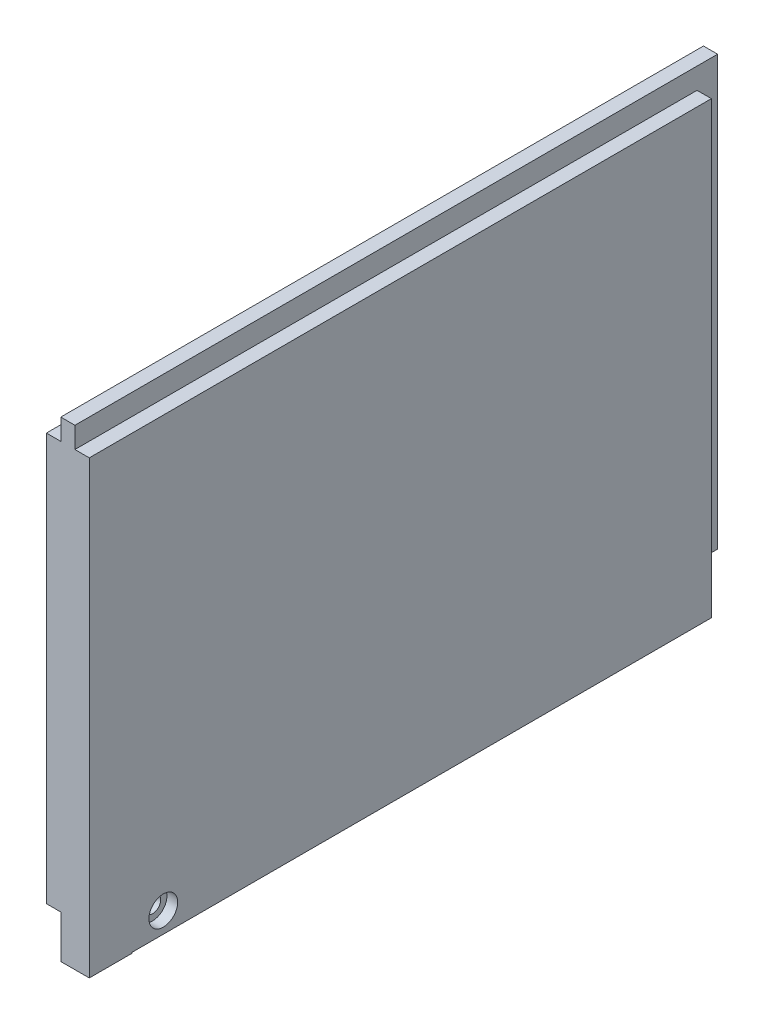
ISO-10303-21;
HEADER;
FILE_DESCRIPTION(('STEP AP214'),'2;1');
FILE_NAME('part.step','',(''),(''),'','','');
FILE_SCHEMA(('AUTOMOTIVE_DESIGN { 1 0 10303 214 1 1 1 1 }'));
ENDSEC;
DATA;
#1=APPLICATION_CONTEXT('core data for automotive mechanical design processes');
#2=APPLICATION_PROTOCOL_DEFINITION('international standard','automotive_design',2000,#1);
#3=PRODUCT_CONTEXT('',#1,'mechanical');
#4=PRODUCT('Part','Part','',(#3));
#5=PRODUCT_RELATED_PRODUCT_CATEGORY('part','',(#4));
#6=PRODUCT_DEFINITION_FORMATION('','',#4);
#7=PRODUCT_DEFINITION_CONTEXT('part definition',#1,'design');
#8=PRODUCT_DEFINITION('design','',#6,#7);
#9=PRODUCT_DEFINITION_SHAPE('','',#8);
#10=(LENGTH_UNIT() NAMED_UNIT(*) SI_UNIT(.MILLI.,.METRE.));
#11=(NAMED_UNIT(*) PLANE_ANGLE_UNIT() SI_UNIT($,.RADIAN.));
#12=(NAMED_UNIT(*) SI_UNIT($,.STERADIAN.) SOLID_ANGLE_UNIT());
#13=UNCERTAINTY_MEASURE_WITH_UNIT(LENGTH_MEASURE(1.E-05),#10,'distance_accuracy_value','');
#14=(GEOMETRIC_REPRESENTATION_CONTEXT(3) GLOBAL_UNCERTAINTY_ASSIGNED_CONTEXT((#13)) GLOBAL_UNIT_ASSIGNED_CONTEXT((#10,
#11,#12)) REPRESENTATION_CONTEXT('',''));
#15=CARTESIAN_POINT('',(0.,0.,0.));
#16=DIRECTION('',(0.,0.,1.));
#17=DIRECTION('',(1.,0.,0.));
#18=AXIS2_PLACEMENT_3D('',#15,#16,#17);
#19=CARTESIAN_POINT('',(0.,0.,0.));
#20=DIRECTION('',(-1.,0.,0.));
#21=DIRECTION('',(0.,0.,1.));
#22=AXIS2_PLACEMENT_3D('',#19,#20,#21);
#23=PLANE('',#22);
#24=DIRECTION('',(0.,0.,-1.));
#25=VECTOR('',#24,1.);
#26=CARTESIAN_POINT('',(0.,2.5,5.));
#27=LINE('',#26,#25);
#28=CARTESIAN_POINT('',(0.,2.5,142.5));
#29=VERTEX_POINT('',#28);
#30=CARTESIAN_POINT('',(0.,2.5,2.5));
#31=VERTEX_POINT('',#30);
#32=EDGE_CURVE('E53',#29,#31,#27,.T.);
#33=ORIENTED_EDGE('',*,*,#32,.T.);
#34=DIRECTION('',(0.,1.,0.));
#35=VECTOR('',#34,1.);
#36=CARTESIAN_POINT('',(0.,90.,2.5));
#37=LINE('',#36,#35);
#38=CARTESIAN_POINT('',(0.,92.5,2.5));
#39=VERTEX_POINT('',#38);
#40=EDGE_CURVE('E11',#31,#39,#37,.T.);
#41=ORIENTED_EDGE('',*,*,#40,.T.);
#42=DIRECTION('',(0.,0.,1.));
#43=VECTOR('',#42,1.);
#44=CARTESIAN_POINT('',(0.,92.5,0.));
#45=LINE('',#44,#43);
#46=CARTESIAN_POINT('',(0.,92.5,142.5));
#47=VERTEX_POINT('',#46);
#48=EDGE_CURVE('E178',#39,#47,#45,.T.);
#49=ORIENTED_EDGE('',*,*,#48,.T.);
#50=DIRECTION('',(0.,-1.,0.));
#51=VECTOR('',#50,1.);
#52=CARTESIAN_POINT('',(0.,0.,142.5));
#53=LINE('',#52,#51);
#54=EDGE_CURVE('E250',#47,#29,#53,.T.);
#55=ORIENTED_EDGE('',*,*,#54,.T.);
#56=EDGE_LOOP('',(#33,#41,#49,#55));
#57=FACE_BOUND('',#56,.T.);
#58=DIRECTION('',(0.,0.,-1.));
#59=VECTOR('',#58,1.);
#60=CARTESIAN_POINT('',(0.,0.,0.));
#61=LINE('',#60,#59);
#62=CARTESIAN_POINT('',(0.,0.,145.));
#63=VERTEX_POINT('',#62);
#64=CARTESIAN_POINT('',(0.,0.,0.));
#65=VERTEX_POINT('',#64);
#66=EDGE_CURVE('E273',#63,#65,#61,.T.);
#67=ORIENTED_EDGE('',*,*,#66,.F.);
#68=DIRECTION('',(0.,-1.,0.));
#69=VECTOR('',#68,1.);
#70=CARTESIAN_POINT('',(0.,0.,145.));
#71=LINE('',#70,#69);
#72=CARTESIAN_POINT('',(0.,95.,145.));
#73=VERTEX_POINT('',#72);
#74=EDGE_CURVE('E277',#73,#63,#71,.T.);
#75=ORIENTED_EDGE('',*,*,#74,.F.);
#76=DIRECTION('',(0.,0.,1.));
#77=VECTOR('',#76,1.);
#78=CARTESIAN_POINT('',(0.,95.,0.));
#79=LINE('',#78,#77);
#80=CARTESIAN_POINT('',(0.,95.,0.));
#81=VERTEX_POINT('',#80);
#82=EDGE_CURVE('E288',#81,#73,#79,.T.);
#83=ORIENTED_EDGE('',*,*,#82,.F.);
#84=DIRECTION('',(0.,1.,0.));
#85=VECTOR('',#84,1.);
#86=CARTESIAN_POINT('',(0.,0.,0.));
#87=LINE('',#86,#85);
#88=EDGE_CURVE('E285',#65,#81,#87,.T.);
#89=ORIENTED_EDGE('',*,*,#88,.F.);
#90=EDGE_LOOP('',(#67,#75,#83,#89));
#91=FACE_BOUND('',#90,.T.);
#92=ADVANCED_FACE('F43',(#57,#91),#23,.T.);
#93=CARTESIAN_POINT('',(-0.000999999999999265,-5.,127.75));
#94=DIRECTION('',(1.,0.,0.));
#95=DIRECTION('',(0.,0.,-1.));
#96=AXIS2_PLACEMENT_3D('',#93,#94,#95);
#97=CYLINDRICAL_SURFACE('',#96,1.9);
#98=CARTESIAN_POINT('',(3.35000000000002,-5.,127.75));
#99=DIRECTION('',(1.,0.,0.));
#100=DIRECTION('',(0.,0.,-1.));
#101=AXIS2_PLACEMENT_3D('',#98,#99,#100);
#102=CIRCLE('',#101,1.9);
#103=CARTESIAN_POINT('',(3.35000000000002,-5.,125.85));
#104=VERTEX_POINT('',#103);
#105=EDGE_CURVE('E214',#104,#104,#102,.F.);
#106=ORIENTED_EDGE('',*,*,#105,.T.);
#107=EDGE_LOOP('',(#106));
#108=FACE_BOUND('',#107,.T.);
#109=CARTESIAN_POINT('',(7.5,-5.,127.75));
#110=DIRECTION('',(1.,0.,0.));
#111=DIRECTION('',(0.,0.,-1.));
#112=AXIS2_PLACEMENT_3D('',#109,#110,#111);
#113=CIRCLE('',#112,1.9);
#114=CARTESIAN_POINT('',(7.5,-5.,125.85));
#115=VERTEX_POINT('',#114);
#116=EDGE_CURVE('E211',#115,#115,#113,.F.);
#117=ORIENTED_EDGE('',*,*,#116,.F.);
#118=EDGE_LOOP('',(#117));
#119=FACE_BOUND('',#118,.T.);
#120=ADVANCED_FACE('F324',(#108,#119),#97,.F.);
#121=CARTESIAN_POINT('',(10.,0.,0.));
#122=DIRECTION('',(0.,1.,0.));
#123=DIRECTION('',(0.,0.,1.));
#124=AXIS2_PLACEMENT_3D('',#121,#122,#123);
#125=PLANE('',#124);
#126=DIRECTION('',(0.,0.,-1.));
#127=VECTOR('',#126,1.);
#128=CARTESIAN_POINT('',(3.35000000000002,0.,0.));
#129=LINE('',#128,#127);
#130=CARTESIAN_POINT('',(3.35000000000002,0.,145.));
#131=VERTEX_POINT('',#130);
#132=CARTESIAN_POINT('',(3.35,0.,0.));
#133=VERTEX_POINT('',#132);
#134=EDGE_CURVE('E217',#131,#133,#129,.T.);
#135=ORIENTED_EDGE('',*,*,#134,.F.);
#136=DIRECTION('',(-1.,0.,0.));
#137=VECTOR('',#136,1.);
#138=CARTESIAN_POINT('',(10.,0.,145.));
#139=LINE('',#138,#137);
#140=EDGE_CURVE('E282',#131,#63,#139,.T.);
#141=ORIENTED_EDGE('',*,*,#140,.T.);
#142=ORIENTED_EDGE('',*,*,#66,.T.);
#143=DIRECTION('',(-1.,0.,0.));
#144=VECTOR('',#143,1.);
#145=CARTESIAN_POINT('',(10.,0.,0.));
#146=LINE('',#145,#144);
#147=EDGE_CURVE('E251',#133,#65,#146,.T.);
#148=ORIENTED_EDGE('',*,*,#147,.F.);
#149=EDGE_LOOP('',(#135,#141,#142,#148));
#150=FACE_BOUND('',#149,.T.);
#151=ADVANCED_FACE('F331',(#150),#125,.F.);
#152=DIRECTION('',(1.,0.,0.));
#153=VECTOR('',#152,1.);
#154=CARTESIAN_POINT('',(0.,0.,0.));
#155=LINE('',#154,#153);
#156=CARTESIAN_POINT('',(6.65,0.,0.));
#157=VERTEX_POINT('',#156);
#158=EDGE_CURVE('E222',#133,#157,#155,.T.);
#159=ORIENTED_EDGE('',*,*,#158,.F.);
#160=DIRECTION('',(0.,0.,-1.));
#161=VECTOR('',#160,1.);
#162=CARTESIAN_POINT('',(3.35,0.,-4.8));
#163=LINE('',#162,#161);
#164=CARTESIAN_POINT('',(3.35,0.,-4.8));
#165=VERTEX_POINT('',#164);
#166=EDGE_CURVE('E258',#133,#165,#163,.T.);
#167=ORIENTED_EDGE('',*,*,#166,.T.);
#168=DIRECTION('',(1.,0.,0.));
#169=VECTOR('',#168,1.);
#170=CARTESIAN_POINT('',(6.65,0.,-4.8));
#171=LINE('',#170,#169);
#172=CARTESIAN_POINT('',(6.65,0.,-4.8));
#173=VERTEX_POINT('',#172);
#174=EDGE_CURVE('E264',#165,#173,#171,.T.);
#175=ORIENTED_EDGE('',*,*,#174,.T.);
#176=DIRECTION('',(0.,0.,1.));
#177=VECTOR('',#176,1.);
#178=CARTESIAN_POINT('',(6.65,0.,-4.8));
#179=LINE('',#178,#177);
#180=EDGE_CURVE('E260',#173,#157,#179,.T.);
#181=ORIENTED_EDGE('',*,*,#180,.T.);
#182=EDGE_LOOP('',(#159,#167,#175,#181));
#183=FACE_BOUND('',#182,.T.);
#184=ADVANCED_FACE('F347',(#183),#125,.F.);
#185=CARTESIAN_POINT('',(10.,95.,0.));
#186=DIRECTION('',(0.,-1.,0.));
#187=DIRECTION('',(0.,0.,-1.));
#188=AXIS2_PLACEMENT_3D('',#185,#186,#187);
#189=PLANE('',#188);
#190=DIRECTION('',(0.,0.,-1.));
#191=VECTOR('',#190,1.);
#192=CARTESIAN_POINT('',(6.65000000000002,95.,145.));
#193=LINE('',#192,#191);
#194=CARTESIAN_POINT('',(6.65000000000001,95.,145.));
#195=VERTEX_POINT('',#194);
#196=CARTESIAN_POINT('',(6.65,95.,0.));
#197=VERTEX_POINT('',#196);
#198=EDGE_CURVE('E233',#195,#197,#193,.T.);
#199=ORIENTED_EDGE('',*,*,#198,.F.);
#200=DIRECTION('',(-1.,0.,0.));
#201=VECTOR('',#200,1.);
#202=CARTESIAN_POINT('',(10.,95.,145.));
#203=LINE('',#202,#201);
#204=CARTESIAN_POINT('',(10.,95.,145.));
#205=VERTEX_POINT('',#204);
#206=EDGE_CURVE('E295',#205,#195,#203,.T.);
#207=ORIENTED_EDGE('',*,*,#206,.F.);
#208=DIRECTION('',(0.,0.,1.));
#209=VECTOR('',#208,1.);
#210=CARTESIAN_POINT('',(10.,95.,0.));
#211=LINE('',#210,#209);
#212=CARTESIAN_POINT('',(10.,95.,0.));
#213=VERTEX_POINT('',#212);
#214=EDGE_CURVE('E276',#213,#205,#211,.T.);
#215=ORIENTED_EDGE('',*,*,#214,.F.);
#216=DIRECTION('',(-1.,0.,0.));
#217=VECTOR('',#216,1.);
#218=CARTESIAN_POINT('',(10.,95.,0.));
#219=LINE('',#218,#217);
#220=EDGE_CURVE('E299',#213,#197,#219,.T.);
#221=ORIENTED_EDGE('',*,*,#220,.T.);
#222=EDGE_LOOP('',(#199,#207,#215,#221));
#223=FACE_BOUND('',#222,.T.);
#224=ADVANCED_FACE('F343',(#223),#189,.F.);
#225=DIRECTION('',(0.,0.,1.));
#226=VECTOR('',#225,1.);
#227=CARTESIAN_POINT('',(3.35,95.,145.));
#228=LINE('',#227,#226);
#229=CARTESIAN_POINT('',(3.35,95.,0.));
#230=VERTEX_POINT('',#229);
#231=CARTESIAN_POINT('',(3.35,95.,145.));
#232=VERTEX_POINT('',#231);
#233=EDGE_CURVE('E247',#230,#232,#228,.T.);
#234=ORIENTED_EDGE('',*,*,#233,.F.);
#235=EDGE_CURVE('E298',#230,#81,#219,.T.);
#236=ORIENTED_EDGE('',*,*,#235,.T.);
#237=ORIENTED_EDGE('',*,*,#82,.T.);
#238=EDGE_CURVE('E294',#232,#73,#203,.T.);
#239=ORIENTED_EDGE('',*,*,#238,.F.);
#240=EDGE_LOOP('',(#234,#236,#237,#239));
#241=FACE_BOUND('',#240,.T.);
#242=ADVANCED_FACE('F346',(#241),#189,.F.);
#243=CARTESIAN_POINT('',(10.,0.,0.));
#244=DIRECTION('',(0.,0.,1.));
#245=DIRECTION('',(1.,0.,0.));
#246=AXIS2_PLACEMENT_3D('',#243,#244,#245);
#247=PLANE('',#246);
#248=DIRECTION('',(0.,1.,0.));
#249=VECTOR('',#248,1.);
#250=CARTESIAN_POINT('',(3.35,-5.82494635168429,0.));
#251=LINE('',#250,#249);
#252=EDGE_CURVE('E266',#133,#230,#251,.T.);
#253=ORIENTED_EDGE('',*,*,#252,.F.);
#254=ORIENTED_EDGE('',*,*,#147,.T.);
#255=ORIENTED_EDGE('',*,*,#88,.T.);
#256=ORIENTED_EDGE('',*,*,#235,.F.);
#257=EDGE_LOOP('',(#253,#254,#255,#256));
#258=FACE_BOUND('',#257,.T.);
#259=ADVANCED_FACE('F351',(#258),#247,.F.);
#260=DIRECTION('',(0.,1.,0.));
#261=VECTOR('',#260,1.);
#262=CARTESIAN_POINT('',(10.,0.,0.));
#263=LINE('',#262,#261);
#264=CARTESIAN_POINT('',(10.,-9.79999999999998,0.));
#265=VERTEX_POINT('',#264);
#266=EDGE_CURVE('E274',#265,#213,#263,.T.);
#267=ORIENTED_EDGE('',*,*,#266,.F.);
#268=DIRECTION('',(1.,0.,0.));
#269=VECTOR('',#268,1.);
#270=CARTESIAN_POINT('',(-0.000999999999999265,-9.79999999999998,0.));
#271=LINE('',#270,#269);
#272=CARTESIAN_POINT('',(3.35000000000002,-9.79999999999998,0.));
#273=VERTEX_POINT('',#272);
#274=EDGE_CURVE('E200',#273,#265,#271,.T.);
#275=ORIENTED_EDGE('',*,*,#274,.F.);
#276=DIRECTION('',(0.,1.,0.));
#277=VECTOR('',#276,1.);
#278=CARTESIAN_POINT('',(3.35,-10.,0.));
#279=LINE('',#278,#277);
#280=EDGE_CURVE('E231',#273,#133,#279,.T.);
#281=ORIENTED_EDGE('',*,*,#280,.T.);
#282=ORIENTED_EDGE('',*,*,#158,.T.);
#283=DIRECTION('',(0.,1.,0.));
#284=VECTOR('',#283,1.);
#285=CARTESIAN_POINT('',(6.65,-5.82494635168429,0.));
#286=LINE('',#285,#284);
#287=EDGE_CURVE('E261',#157,#197,#286,.T.);
#288=ORIENTED_EDGE('',*,*,#287,.T.);
#289=ORIENTED_EDGE('',*,*,#220,.F.);
#290=EDGE_LOOP('',(#267,#275,#281,#282,#288,#289));
#291=FACE_BOUND('',#290,.T.);
#292=ADVANCED_FACE('F341',(#291),#247,.F.);
#293=CARTESIAN_POINT('',(10.,0.,145.));
#294=DIRECTION('',(0.,0.,-1.));
#295=DIRECTION('',(-1.,0.,0.));
#296=AXIS2_PLACEMENT_3D('',#293,#294,#295);
#297=PLANE('',#296);
#298=ORIENTED_EDGE('',*,*,#74,.T.);
#299=ORIENTED_EDGE('',*,*,#140,.F.);
#300=DIRECTION('',(0.,1.,0.));
#301=VECTOR('',#300,1.);
#302=CARTESIAN_POINT('',(3.35000000000002,-10.,145.));
#303=LINE('',#302,#301);
#304=CARTESIAN_POINT('',(3.35000000000002,-10.,145.));
#305=VERTEX_POINT('',#304);
#306=EDGE_CURVE('E226',#305,#131,#303,.T.);
#307=ORIENTED_EDGE('',*,*,#306,.F.);
#308=DIRECTION('',(-1.,0.,0.));
#309=VECTOR('',#308,1.);
#310=CARTESIAN_POINT('',(0.,-10.,145.));
#311=LINE('',#310,#309);
#312=CARTESIAN_POINT('',(10.,-10.,145.));
#313=VERTEX_POINT('',#312);
#314=EDGE_CURVE('E224',#313,#305,#311,.T.);
#315=ORIENTED_EDGE('',*,*,#314,.F.);
#316=DIRECTION('',(0.,-1.,0.));
#317=VECTOR('',#316,1.);
#318=CARTESIAN_POINT('',(10.,0.,145.));
#319=LINE('',#318,#317);
#320=EDGE_CURVE('E279',#205,#313,#319,.T.);
#321=ORIENTED_EDGE('',*,*,#320,.F.);
#322=ORIENTED_EDGE('',*,*,#206,.T.);
#323=DIRECTION('',(0.,-1.,0.));
#324=VECTOR('',#323,1.);
#325=CARTESIAN_POINT('',(6.65000000000002,99.9,145.));
#326=LINE('',#325,#324);
#327=CARTESIAN_POINT('',(6.65000000000002,99.9,145.));
#328=VERTEX_POINT('',#327);
#329=EDGE_CURVE('E244',#328,#195,#326,.T.);
#330=ORIENTED_EDGE('',*,*,#329,.F.);
#331=DIRECTION('',(1.,0.,0.));
#332=VECTOR('',#331,1.);
#333=CARTESIAN_POINT('',(3.35,99.9,145.));
#334=LINE('',#333,#332);
#335=CARTESIAN_POINT('',(3.35,99.9,145.));
#336=VERTEX_POINT('',#335);
#337=EDGE_CURVE('E242',#336,#328,#334,.T.);
#338=ORIENTED_EDGE('',*,*,#337,.F.);
#339=DIRECTION('',(0.,-1.,0.));
#340=VECTOR('',#339,1.);
#341=CARTESIAN_POINT('',(3.35,99.9,145.));
#342=LINE('',#341,#340);
#343=EDGE_CURVE('E254',#336,#232,#342,.T.);
#344=ORIENTED_EDGE('',*,*,#343,.T.);
#345=ORIENTED_EDGE('',*,*,#238,.T.);
#346=EDGE_LOOP('',(#298,#299,#307,#315,#321,#322,#330,#338,#344,#345));
#347=FACE_BOUND('',#346,.T.);
#348=ADVANCED_FACE('F338',(#347),#297,.F.);
#349=CARTESIAN_POINT('',(10.,0.,0.));
#350=DIRECTION('',(-1.,0.,0.));
#351=DIRECTION('',(0.,0.,1.));
#352=AXIS2_PLACEMENT_3D('',#349,#350,#351);
#353=PLANE('',#352);
#354=CARTESIAN_POINT('',(10.,-5.,127.75));
#355=DIRECTION('',(1.,0.,0.));
#356=DIRECTION('',(0.,0.,-1.));
#357=AXIS2_PLACEMENT_3D('',#354,#355,#356);
#358=CIRCLE('',#357,3.35);
#359=CARTESIAN_POINT('',(10.,-5.,124.4));
#360=VERTEX_POINT('',#359);
#361=EDGE_CURVE('E204',#360,#360,#358,.T.);
#362=ORIENTED_EDGE('',*,*,#361,.F.);
#363=EDGE_LOOP('',(#362));
#364=FACE_BOUND('',#363,.T.);
#365=DIRECTION('',(0.,0.,1.));
#366=VECTOR('',#365,1.);
#367=CARTESIAN_POINT('',(10.,-10.,0.));
#368=LINE('',#367,#366);
#369=CARTESIAN_POINT('',(10.,-10.,135.));
#370=VERTEX_POINT('',#369);
#371=EDGE_CURVE('E221',#370,#313,#368,.T.);
#372=ORIENTED_EDGE('',*,*,#371,.F.);
#373=DIRECTION('',(0.,-1.,0.));
#374=VECTOR('',#373,1.);
#375=CARTESIAN_POINT('',(10.,-10.,135.));
#376=LINE('',#375,#374);
#377=CARTESIAN_POINT('',(10.,-9.8,135.));
#378=VERTEX_POINT('',#377);
#379=EDGE_CURVE('E198',#378,#370,#376,.T.);
#380=ORIENTED_EDGE('',*,*,#379,.F.);
#381=DIRECTION('',(0.,0.,1.));
#382=VECTOR('',#381,1.);
#383=CARTESIAN_POINT('',(10.,-9.8,135.));
#384=LINE('',#383,#382);
#385=EDGE_CURVE('E195',#265,#378,#384,.T.);
#386=ORIENTED_EDGE('',*,*,#385,.F.);
#387=ORIENTED_EDGE('',*,*,#266,.T.);
#388=ORIENTED_EDGE('',*,*,#214,.T.);
#389=ORIENTED_EDGE('',*,*,#320,.T.);
#390=EDGE_LOOP('',(#372,#380,#386,#387,#388,#389));
#391=FACE_BOUND('',#390,.T.);
#392=ADVANCED_FACE('F336',(#364,#391),#353,.F.);
#393=CARTESIAN_POINT('',(6.65,-5.82494635168429,-4.8));
#394=DIRECTION('',(1.,0.,0.));
#395=DIRECTION('',(0.,0.,-1.));
#396=AXIS2_PLACEMENT_3D('',#393,#394,#395);
#397=PLANE('',#396);
#398=ORIENTED_EDGE('',*,*,#180,.F.);
#399=DIRECTION('',(0.,1.,0.));
#400=VECTOR('',#399,1.);
#401=CARTESIAN_POINT('',(6.65,-5.82494635168429,-4.8));
#402=LINE('',#401,#400);
#403=CARTESIAN_POINT('',(6.65,99.9,-4.8));
#404=VERTEX_POINT('',#403);
#405=EDGE_CURVE('E257',#173,#404,#402,.T.);
#406=ORIENTED_EDGE('',*,*,#405,.T.);
#407=DIRECTION('',(0.,0.,-1.));
#408=VECTOR('',#407,1.);
#409=CARTESIAN_POINT('',(6.65000000000002,99.9,145.));
#410=LINE('',#409,#408);
#411=EDGE_CURVE('E234',#328,#404,#410,.T.);
#412=ORIENTED_EDGE('',*,*,#411,.F.);
#413=ORIENTED_EDGE('',*,*,#329,.T.);
#414=ORIENTED_EDGE('',*,*,#198,.T.);
#415=ORIENTED_EDGE('',*,*,#287,.F.);
#416=EDGE_LOOP('',(#398,#406,#412,#413,#414,#415));
#417=FACE_BOUND('',#416,.T.);
#418=ADVANCED_FACE('F418',(#417),#397,.T.);
#419=CARTESIAN_POINT('',(3.35,-5.82494635168429,-4.8));
#420=DIRECTION('',(-1.,0.,0.));
#421=DIRECTION('',(0.,0.,1.));
#422=AXIS2_PLACEMENT_3D('',#419,#420,#421);
#423=PLANE('',#422);
#424=ORIENTED_EDGE('',*,*,#166,.F.);
#425=ORIENTED_EDGE('',*,*,#252,.T.);
#426=ORIENTED_EDGE('',*,*,#233,.T.);
#427=ORIENTED_EDGE('',*,*,#343,.F.);
#428=DIRECTION('',(0.,0.,1.));
#429=VECTOR('',#428,1.);
#430=CARTESIAN_POINT('',(3.35,99.9,145.));
#431=LINE('',#430,#429);
#432=CARTESIAN_POINT('',(3.35,99.9,-4.8));
#433=VERTEX_POINT('',#432);
#434=EDGE_CURVE('E240',#433,#336,#431,.T.);
#435=ORIENTED_EDGE('',*,*,#434,.F.);
#436=DIRECTION('',(0.,1.,0.));
#437=VECTOR('',#436,1.);
#438=CARTESIAN_POINT('',(3.35,-5.82494635168429,-4.8));
#439=LINE('',#438,#437);
#440=EDGE_CURVE('E269',#165,#433,#439,.T.);
#441=ORIENTED_EDGE('',*,*,#440,.F.);
#442=EDGE_LOOP('',(#424,#425,#426,#427,#435,#441));
#443=FACE_BOUND('',#442,.T.);
#444=ADVANCED_FACE('F388',(#443),#423,.T.);
#445=CARTESIAN_POINT('',(6.65,-5.82494635168429,-4.8));
#446=DIRECTION('',(0.,0.,-1.));
#447=DIRECTION('',(-1.,0.,0.));
#448=AXIS2_PLACEMENT_3D('',#445,#446,#447);
#449=PLANE('',#448);
#450=ORIENTED_EDGE('',*,*,#174,.F.);
#451=ORIENTED_EDGE('',*,*,#440,.T.);
#452=DIRECTION('',(-1.,0.,0.));
#453=VECTOR('',#452,1.);
#454=CARTESIAN_POINT('',(3.35,99.9,-4.8));
#455=LINE('',#454,#453);
#456=EDGE_CURVE('E237',#404,#433,#455,.T.);
#457=ORIENTED_EDGE('',*,*,#456,.F.);
#458=ORIENTED_EDGE('',*,*,#405,.F.);
#459=EDGE_LOOP('',(#450,#451,#457,#458));
#460=FACE_BOUND('',#459,.T.);
#461=ADVANCED_FACE('F424',(#460),#449,.T.);
#462=CARTESIAN_POINT('',(0.,99.9,0.));
#463=DIRECTION('',(0.,-1.,0.));
#464=DIRECTION('',(0.,0.,-1.));
#465=AXIS2_PLACEMENT_3D('',#462,#463,#464);
#466=PLANE('',#465);
#467=ORIENTED_EDGE('',*,*,#411,.T.);
#468=ORIENTED_EDGE('',*,*,#456,.T.);
#469=ORIENTED_EDGE('',*,*,#434,.T.);
#470=ORIENTED_EDGE('',*,*,#337,.T.);
#471=EDGE_LOOP('',(#467,#468,#469,#470));
#472=FACE_BOUND('',#471,.T.);
#473=ADVANCED_FACE('F422',(#472),#466,.F.);
#474=CARTESIAN_POINT('',(3.35000000000002,-10.,0.));
#475=DIRECTION('',(1.,0.,0.));
#476=DIRECTION('',(0.,0.,-1.));
#477=AXIS2_PLACEMENT_3D('',#474,#475,#476);
#478=PLANE('',#477);
#479=ORIENTED_EDGE('',*,*,#105,.F.);
#480=EDGE_LOOP('',(#479));
#481=FACE_BOUND('',#480,.T.);
#482=DIRECTION('',(0.,0.,-1.));
#483=VECTOR('',#482,1.);
#484=CARTESIAN_POINT('',(3.35000000000002,-9.8,135.));
#485=LINE('',#484,#483);
#486=CARTESIAN_POINT('',(3.35000000000002,-9.8,135.));
#487=VERTEX_POINT('',#486);
#488=EDGE_CURVE('E190',#487,#273,#485,.T.);
#489=ORIENTED_EDGE('',*,*,#488,.F.);
#490=DIRECTION('',(0.,1.,0.));
#491=VECTOR('',#490,1.);
#492=CARTESIAN_POINT('',(3.35000000000002,-10.,135.));
#493=LINE('',#492,#491);
#494=CARTESIAN_POINT('',(3.35,-10.,135.));
#495=VERTEX_POINT('',#494);
#496=EDGE_CURVE('E192',#495,#487,#493,.T.);
#497=ORIENTED_EDGE('',*,*,#496,.F.);
#498=DIRECTION('',(0.,0.,-1.));
#499=VECTOR('',#498,1.);
#500=CARTESIAN_POINT('',(3.35000000000002,-10.,0.));
#501=LINE('',#500,#499);
#502=EDGE_CURVE('E218',#305,#495,#501,.T.);
#503=ORIENTED_EDGE('',*,*,#502,.F.);
#504=ORIENTED_EDGE('',*,*,#306,.T.);
#505=ORIENTED_EDGE('',*,*,#134,.T.);
#506=ORIENTED_EDGE('',*,*,#280,.F.);
#507=EDGE_LOOP('',(#489,#497,#503,#504,#505,#506));
#508=FACE_BOUND('',#507,.T.);
#509=ADVANCED_FACE('F399',(#481,#508),#478,.F.);
#510=CARTESIAN_POINT('',(0.,-10.,0.));
#511=DIRECTION('',(0.,-1.,0.));
#512=DIRECTION('',(0.,0.,-1.));
#513=AXIS2_PLACEMENT_3D('',#510,#511,#512);
#514=PLANE('',#513);
#515=DIRECTION('',(1.,0.,0.));
#516=VECTOR('',#515,1.);
#517=CARTESIAN_POINT('',(-0.000999999999999265,-10.,135.));
#518=LINE('',#517,#516);
#519=EDGE_CURVE('E201',#495,#370,#518,.T.);
#520=ORIENTED_EDGE('',*,*,#519,.T.);
#521=ORIENTED_EDGE('',*,*,#371,.T.);
#522=ORIENTED_EDGE('',*,*,#314,.T.);
#523=ORIENTED_EDGE('',*,*,#502,.T.);
#524=EDGE_LOOP('',(#520,#521,#522,#523));
#525=FACE_BOUND('',#524,.T.);
#526=ADVANCED_FACE('F409',(#525),#514,.T.);
#527=CARTESIAN_POINT('',(7.5,-5.,127.75));
#528=DIRECTION('',(1.,0.,0.));
#529=DIRECTION('',(0.,0.,-1.));
#530=AXIS2_PLACEMENT_3D('',#527,#528,#529);
#531=PLANE('',#530);
#532=CARTESIAN_POINT('',(7.5,-5.,127.75));
#533=DIRECTION('',(1.,0.,0.));
#534=DIRECTION('',(0.,0.,-1.));
#535=AXIS2_PLACEMENT_3D('',#532,#533,#534);
#536=CIRCLE('',#535,3.35);
#537=CARTESIAN_POINT('',(7.5,-5.,124.4));
#538=VERTEX_POINT('',#537);
#539=EDGE_CURVE('E208',#538,#538,#536,.T.);
#540=ORIENTED_EDGE('',*,*,#539,.T.);
#541=EDGE_LOOP('',(#540));
#542=FACE_BOUND('',#541,.T.);
#543=ORIENTED_EDGE('',*,*,#116,.T.);
#544=EDGE_LOOP('',(#543));
#545=FACE_BOUND('',#544,.T.);
#546=ADVANCED_FACE('F445',(#542,#545),#531,.T.);
#547=CARTESIAN_POINT('',(7.5,-5.,127.75));
#548=DIRECTION('',(1.,0.,0.));
#549=DIRECTION('',(0.,0.,-1.));
#550=AXIS2_PLACEMENT_3D('',#547,#548,#549);
#551=CYLINDRICAL_SURFACE('',#550,3.35);
#552=ORIENTED_EDGE('',*,*,#539,.F.);
#553=EDGE_LOOP('',(#552));
#554=FACE_BOUND('',#553,.T.);
#555=ORIENTED_EDGE('',*,*,#361,.T.);
#556=EDGE_LOOP('',(#555));
#557=FACE_BOUND('',#556,.T.);
#558=ADVANCED_FACE('F443',(#554,#557),#551,.F.);
#559=CARTESIAN_POINT('',(-0.000999999999999265,-10.,135.));
#560=DIRECTION('',(0.,0.,1.));
#561=DIRECTION('',(1.,0.,0.));
#562=AXIS2_PLACEMENT_3D('',#559,#560,#561);
#563=PLANE('',#562);
#564=ORIENTED_EDGE('',*,*,#496,.T.);
#565=DIRECTION('',(1.,0.,0.));
#566=VECTOR('',#565,1.);
#567=CARTESIAN_POINT('',(-0.000999999999999265,-9.8,135.));
#568=LINE('',#567,#566);
#569=EDGE_CURVE('E205',#487,#378,#568,.T.);
#570=ORIENTED_EDGE('',*,*,#569,.T.);
#571=ORIENTED_EDGE('',*,*,#379,.T.);
#572=ORIENTED_EDGE('',*,*,#519,.F.);
#573=EDGE_LOOP('',(#564,#570,#571,#572));
#574=FACE_BOUND('',#573,.T.);
#575=ADVANCED_FACE('F406',(#574),#563,.F.);
#576=CARTESIAN_POINT('',(-0.000999999999999265,-9.8,135.));
#577=DIRECTION('',(0.,1.,0.));
#578=DIRECTION('',(0.,0.,1.));
#579=AXIS2_PLACEMENT_3D('',#576,#577,#578);
#580=PLANE('',#579);
#581=ORIENTED_EDGE('',*,*,#488,.T.);
#582=ORIENTED_EDGE('',*,*,#274,.T.);
#583=ORIENTED_EDGE('',*,*,#385,.T.);
#584=ORIENTED_EDGE('',*,*,#569,.F.);
#585=EDGE_LOOP('',(#581,#582,#583,#584));
#586=FACE_BOUND('',#585,.T.);
#587=ADVANCED_FACE('F402',(#586),#580,.F.);
#588=CARTESIAN_POINT('',(5.,0.,0.));
#589=DIRECTION('',(-1.,0.,0.));
#590=DIRECTION('',(0.,0.,1.));
#591=AXIS2_PLACEMENT_3D('',#588,#589,#590);
#592=PLANE('',#591);
#593=DIRECTION('',(0.,0.,1.));
#594=VECTOR('',#593,1.);
#595=CARTESIAN_POINT('',(5.,90.,0.));
#596=LINE('',#595,#594);
#597=CARTESIAN_POINT('',(5.,90.,5.));
#598=VERTEX_POINT('',#597);
#599=CARTESIAN_POINT('',(5.,90.,140.));
#600=VERTEX_POINT('',#599);
#601=EDGE_CURVE('E168',#598,#600,#596,.T.);
#602=ORIENTED_EDGE('',*,*,#601,.F.);
#603=DIRECTION('',(0.,-1.,0.));
#604=VECTOR('',#603,1.);
#605=CARTESIAN_POINT('',(5.,0.,5.));
#606=LINE('',#605,#604);
#607=CARTESIAN_POINT('',(5.,5.,5.));
#608=VERTEX_POINT('',#607);
#609=EDGE_CURVE('E170',#598,#608,#606,.T.);
#610=ORIENTED_EDGE('',*,*,#609,.T.);
#611=DIRECTION('',(0.,0.,1.));
#612=VECTOR('',#611,1.);
#613=CARTESIAN_POINT('',(5.,5.,0.));
#614=LINE('',#613,#612);
#615=CARTESIAN_POINT('',(5.,5.,140.));
#616=VERTEX_POINT('',#615);
#617=EDGE_CURVE('E185',#608,#616,#614,.T.);
#618=ORIENTED_EDGE('',*,*,#617,.T.);
#619=DIRECTION('',(0.,-1.,0.));
#620=VECTOR('',#619,1.);
#621=CARTESIAN_POINT('',(5.,0.,140.));
#622=LINE('',#621,#620);
#623=EDGE_CURVE('E172',#600,#616,#622,.T.);
#624=ORIENTED_EDGE('',*,*,#623,.F.);
#625=EDGE_LOOP('',(#602,#610,#618,#624));
#626=FACE_BOUND('',#625,.T.);
#627=ADVANCED_FACE('F169',(#626),#592,.T.);
#628=CARTESIAN_POINT('',(0.,0.,142.5));
#629=DIRECTION('',(0.447213595499956,0.,0.894427190999917));
#630=DIRECTION('',(0.,-1.,0.));
#631=AXIS2_PLACEMENT_3D('',#628,#629,#630);
#632=PLANE('',#631);
#633=DIRECTION('',(0.816496580927727,0.408248290463861,-0.408248290463861));
#634=VECTOR('',#633,1.);
#635=CARTESIAN_POINT('',(51.6666666666666,28.3333333333332,116.666666666667));
#636=LINE('',#635,#634);
#637=EDGE_CURVE('E179',#29,#616,#636,.T.);
#638=ORIENTED_EDGE('',*,*,#637,.F.);
#639=ORIENTED_EDGE('',*,*,#54,.F.);
#640=DIRECTION('',(0.816496580927727,-0.408248290463861,-0.408248290463861));
#641=VECTOR('',#640,1.);
#642=CARTESIAN_POINT('',(47.4999999999999,68.7500000000002,118.75));
#643=LINE('',#642,#641);
#644=EDGE_CURVE('E48',#600,#47,#643,.F.);
#645=ORIENTED_EDGE('',*,*,#644,.F.);
#646=ORIENTED_EDGE('',*,*,#623,.T.);
#647=EDGE_LOOP('',(#638,#639,#645,#646));
#648=FACE_BOUND('',#647,.T.);
#649=ADVANCED_FACE('F46',(#648),#632,.F.);
#650=CARTESIAN_POINT('',(0.,92.5,0.));
#651=DIRECTION('',(0.447213595499956,0.894427190999917,0.));
#652=DIRECTION('',(0.,0.,1.));
#653=AXIS2_PLACEMENT_3D('',#650,#651,#652);
#654=PLANE('',#653);
#655=ORIENTED_EDGE('',*,*,#644,.T.);
#656=ORIENTED_EDGE('',*,*,#48,.F.);
#657=DIRECTION('',(-0.816496580927727,0.408248290463861,-0.408248290463861));
#658=VECTOR('',#657,1.);
#659=CARTESIAN_POINT('',(35.,75.0000000000001,19.9999999999999));
#660=LINE('',#659,#658);
#661=EDGE_CURVE('E66',#598,#39,#660,.T.);
#662=ORIENTED_EDGE('',*,*,#661,.F.);
#663=ORIENTED_EDGE('',*,*,#601,.T.);
#664=EDGE_LOOP('',(#655,#656,#662,#663));
#665=FACE_BOUND('',#664,.T.);
#666=ADVANCED_FACE('F177',(#665),#654,.F.);
#667=CARTESIAN_POINT('',(5.00000000000003,5.,0.));
#668=DIRECTION('',(-0.447213595499956,0.894427190999917,0.));
#669=DIRECTION('',(0.,0.,-1.));
#670=AXIS2_PLACEMENT_3D('',#667,#668,#669);
#671=PLANE('',#670);
#672=ORIENTED_EDGE('',*,*,#637,.T.);
#673=ORIENTED_EDGE('',*,*,#617,.F.);
#674=DIRECTION('',(-0.816496580927727,-0.408248290463861,-0.408248290463861));
#675=VECTOR('',#674,1.);
#676=CARTESIAN_POINT('',(3.33333333333337,4.16666666666668,4.16666666666667));
#677=LINE('',#676,#675);
#678=EDGE_CURVE('E180',#31,#608,#677,.F.);
#679=ORIENTED_EDGE('',*,*,#678,.F.);
#680=ORIENTED_EDGE('',*,*,#32,.F.);
#681=EDGE_LOOP('',(#672,#673,#679,#680));
#682=FACE_BOUND('',#681,.T.);
#683=ADVANCED_FACE('F314',(#682),#671,.T.);
#684=CARTESIAN_POINT('',(5.00000000000003,0.,5.));
#685=DIRECTION('',(-0.447213595499956,0.,0.894427190999917));
#686=DIRECTION('',(0.,1.,0.));
#687=AXIS2_PLACEMENT_3D('',#684,#685,#686);
#688=PLANE('',#687);
#689=ORIENTED_EDGE('',*,*,#661,.T.);
#690=ORIENTED_EDGE('',*,*,#40,.F.);
#691=ORIENTED_EDGE('',*,*,#678,.T.);
#692=ORIENTED_EDGE('',*,*,#609,.F.);
#693=EDGE_LOOP('',(#689,#690,#691,#692));
#694=FACE_BOUND('',#693,.T.);
#695=ADVANCED_FACE('F182',(#694),#688,.T.);
#696=CLOSED_SHELL('',(#92,#120,#151,#184,#224,#242,#259,#292,#348,#392,#418,#444,#461,#473,#509,
#526,#546,#558,#575,#587,#627,#649,#666,#683,#695));
#697=MANIFOLD_SOLID_BREP('B2',#696);
#698=ADVANCED_BREP_SHAPE_REPRESENTATION('',(#18,#697),#14);
#699=SHAPE_DEFINITION_REPRESENTATION(#9,#698);
ENDSEC;
END-ISO-10303-21;
